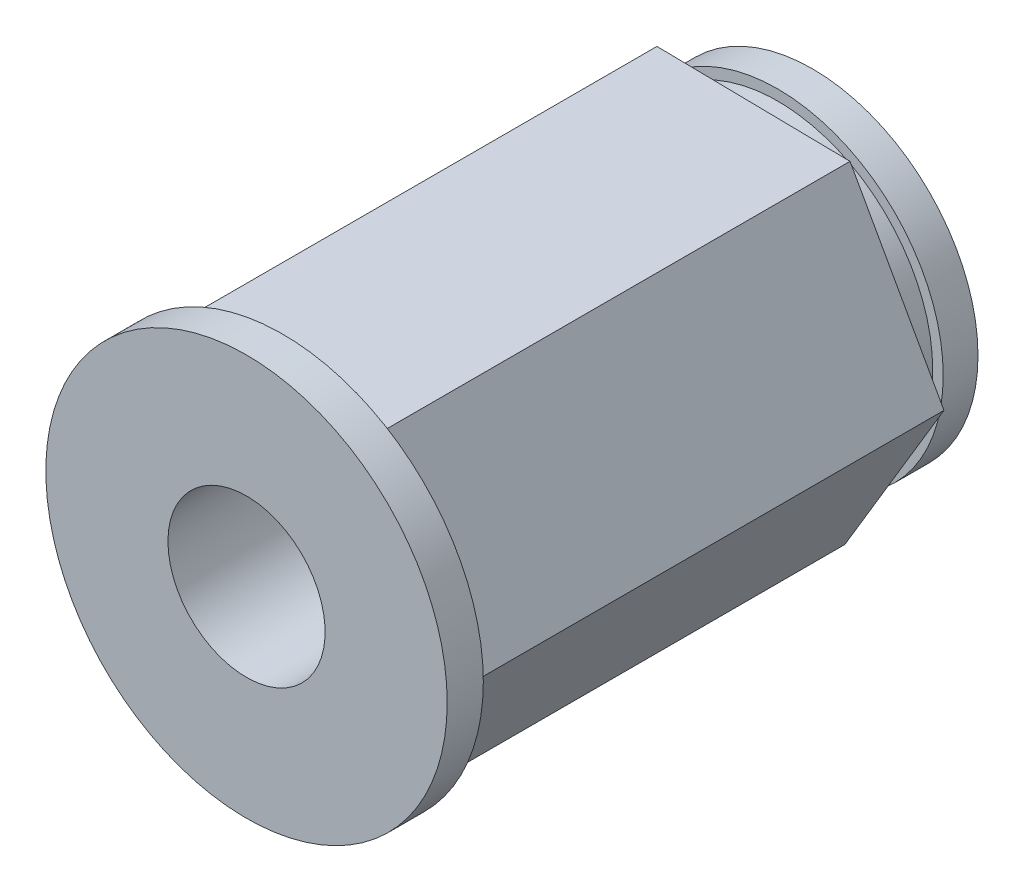
ISO-10303-21;
HEADER;
FILE_DESCRIPTION(('STEP AP214'),'2;1');
FILE_NAME('part.step','',(''),(''),'','','');
FILE_SCHEMA(('AUTOMOTIVE_DESIGN { 1 0 10303 214 1 1 1 1 }'));
ENDSEC;
DATA;
#1=APPLICATION_CONTEXT('core data for automotive mechanical design processes');
#2=APPLICATION_PROTOCOL_DEFINITION('international standard','automotive_design',2000,#1);
#3=PRODUCT_CONTEXT('',#1,'mechanical');
#4=PRODUCT('Part','Part','',(#3));
#5=PRODUCT_RELATED_PRODUCT_CATEGORY('part','',(#4));
#6=PRODUCT_DEFINITION_FORMATION('','',#4);
#7=PRODUCT_DEFINITION_CONTEXT('part definition',#1,'design');
#8=PRODUCT_DEFINITION('design','',#6,#7);
#9=PRODUCT_DEFINITION_SHAPE('','',#8);
#10=(LENGTH_UNIT() NAMED_UNIT(*) SI_UNIT(.MILLI.,.METRE.));
#11=(NAMED_UNIT(*) PLANE_ANGLE_UNIT() SI_UNIT($,.RADIAN.));
#12=(NAMED_UNIT(*) SI_UNIT($,.STERADIAN.) SOLID_ANGLE_UNIT());
#13=UNCERTAINTY_MEASURE_WITH_UNIT(LENGTH_MEASURE(1.E-05),#10,'distance_accuracy_value','');
#14=(GEOMETRIC_REPRESENTATION_CONTEXT(3) GLOBAL_UNCERTAINTY_ASSIGNED_CONTEXT((#13)) GLOBAL_UNIT_ASSIGNED_CONTEXT((#10,
#11,#12)) REPRESENTATION_CONTEXT('',''));
#15=CARTESIAN_POINT('',(0.,0.,0.));
#16=DIRECTION('',(0.,0.,1.));
#17=DIRECTION('',(1.,0.,0.));
#18=AXIS2_PLACEMENT_3D('',#15,#16,#17);
#19=CARTESIAN_POINT('',(0.,0.,-8.89));
#20=DIRECTION('',(0.,0.,1.));
#21=DIRECTION('',(1.,0.,0.));
#22=AXIS2_PLACEMENT_3D('',#19,#20,#21);
#23=PLANE('',#22);
#24=DIRECTION('',(-0.486564950383206,0.873644406528531,0.));
#25=VECTOR('',#24,1.);
#26=CARTESIAN_POINT('',(7.33147385372676,-0.113245156428048,-8.89));
#27=LINE('',#26,#25);
#28=CARTESIAN_POINT('',(7.33147385372676,-0.113245156428048,-8.89));
#29=VERTEX_POINT('',#28);
#30=CARTESIAN_POINT('',(3.76381010918559,6.29262002629474,-8.89));
#31=VERTEX_POINT('',#30);
#32=EDGE_CURVE('E123',#29,#31,#27,.T.);
#33=ORIENTED_EDGE('',*,*,#32,.F.);
#34=DIRECTION('',(0.513315774736285,0.858199810887236,0.));
#35=VECTOR('',#34,1.);
#36=CARTESIAN_POINT('',(3.56766374454116,-6.40586518272278,-8.89));
#37=LINE('',#36,#35);
#38=CARTESIAN_POINT('',(3.56766374454116,-6.40586518272278,-8.89));
#39=VERTEX_POINT('',#38);
#40=EDGE_CURVE('E133',#39,#29,#37,.T.);
#41=ORIENTED_EDGE('',*,*,#40,.F.);
#42=DIRECTION('',(0.99988072511949,-0.0154445956412951,0.));
#43=VECTOR('',#42,1.);
#44=CARTESIAN_POINT('',(-3.76381010918559,-6.29262002629474,-8.89));
#45=LINE('',#44,#43);
#46=CARTESIAN_POINT('',(-3.76381010918559,-6.29262002629474,-8.89));
#47=VERTEX_POINT('',#46);
#48=EDGE_CURVE('E131',#47,#39,#45,.T.);
#49=ORIENTED_EDGE('',*,*,#48,.F.);
#50=DIRECTION('',(0.486564950383205,-0.873644406528531,0.));
#51=VECTOR('',#50,1.);
#52=CARTESIAN_POINT('',(-7.33147385372675,0.113245156428045,-8.89));
#53=LINE('',#52,#51);
#54=CARTESIAN_POINT('',(-7.33147385372675,0.113245156428045,-8.89));
#55=VERTEX_POINT('',#54);
#56=EDGE_CURVE('E128',#55,#47,#53,.T.);
#57=ORIENTED_EDGE('',*,*,#56,.F.);
#58=DIRECTION('',(-0.513315774736285,-0.858199810887236,0.));
#59=VECTOR('',#58,1.);
#60=CARTESIAN_POINT('',(-3.56766374454115,6.40586518272278,-8.89));
#61=LINE('',#60,#59);
#62=CARTESIAN_POINT('',(-3.56766374454115,6.40586518272278,-8.89));
#63=VERTEX_POINT('',#62);
#64=EDGE_CURVE('E126',#63,#55,#61,.T.);
#65=ORIENTED_EDGE('',*,*,#64,.F.);
#66=DIRECTION('',(-0.99988072511949,0.0154445956412951,0.));
#67=VECTOR('',#66,1.);
#68=CARTESIAN_POINT('',(3.76381010918559,6.29262002629474,-8.89));
#69=LINE('',#68,#67);
#70=EDGE_CURVE('E105',#31,#63,#69,.T.);
#71=ORIENTED_EDGE('',*,*,#70,.F.);
#72=EDGE_LOOP('',(#33,#41,#49,#57,#65,#71));
#73=FACE_BOUND('',#72,.T.);
#74=CARTESIAN_POINT('',(0.,0.,-8.89));
#75=DIRECTION('',(0.,0.,1.));
#76=DIRECTION('',(1.,0.,0.));
#77=AXIS2_PLACEMENT_3D('',#74,#75,#76);
#78=CIRCLE('',#77,5.88645);
#79=CARTESIAN_POINT('',(5.88645,0.,-8.89));
#80=VERTEX_POINT('',#79);
#81=EDGE_CURVE('E11',#80,#80,#78,.F.);
#82=ORIENTED_EDGE('',*,*,#81,.F.);
#83=EDGE_LOOP('',(#82));
#84=FACE_BOUND('',#83,.T.);
#85=ADVANCED_FACE('F32',(#73,#84),#23,.F.);
#86=CARTESIAN_POINT('',(7.33147385372676,-0.113245156428048,-8.89));
#87=DIRECTION('',(0.87364440652853,0.486564950383206,0.));
#88=DIRECTION('',(-0.486564950383206,0.873644406528531,0.));
#89=AXIS2_PLACEMENT_3D('',#86,#87,#88);
#90=PLANE('',#89);
#91=DIRECTION('',(0.,0.,1.));
#92=VECTOR('',#91,1.);
#93=CARTESIAN_POINT('',(3.76381010918559,6.29262002629474,-8.89));
#94=LINE('',#93,#92);
#95=CARTESIAN_POINT('',(3.76381010918559,6.29262002629474,8.89));
#96=VERTEX_POINT('',#95);
#97=EDGE_CURVE('E106',#31,#96,#94,.T.);
#98=ORIENTED_EDGE('',*,*,#97,.T.);
#99=DIRECTION('',(-0.486564950383206,0.873644406528531,0.));
#100=VECTOR('',#99,1.);
#101=CARTESIAN_POINT('',(7.33147385372676,-0.113245156428048,8.89));
#102=LINE('',#101,#100);
#103=CARTESIAN_POINT('',(7.33147385372676,-0.113245156428048,8.89));
#104=VERTEX_POINT('',#103);
#105=EDGE_CURVE('E111',#104,#96,#102,.T.);
#106=ORIENTED_EDGE('',*,*,#105,.F.);
#107=DIRECTION('',(0.,0.,1.));
#108=VECTOR('',#107,1.);
#109=CARTESIAN_POINT('',(7.33147385372676,-0.113245156428048,-8.89));
#110=LINE('',#109,#108);
#111=EDGE_CURVE('E40',#29,#104,#110,.T.);
#112=ORIENTED_EDGE('',*,*,#111,.F.);
#113=ORIENTED_EDGE('',*,*,#32,.T.);
#114=EDGE_LOOP('',(#98,#106,#112,#113));
#115=FACE_BOUND('',#114,.T.);
#116=ADVANCED_FACE('F34',(#115),#90,.T.);
#117=CARTESIAN_POINT('',(3.56766374454116,-6.40586518272278,-8.89));
#118=DIRECTION('',(0.858199810887236,-0.513315774736285,0.));
#119=DIRECTION('',(0.513315774736285,0.858199810887236,0.));
#120=AXIS2_PLACEMENT_3D('',#117,#118,#119);
#121=PLANE('',#120);
#122=ORIENTED_EDGE('',*,*,#111,.T.);
#123=DIRECTION('',(0.513315774736285,0.858199810887236,0.));
#124=VECTOR('',#123,1.);
#125=CARTESIAN_POINT('',(3.56766374454116,-6.40586518272278,8.89));
#126=LINE('',#125,#124);
#127=CARTESIAN_POINT('',(3.56766374454116,-6.40586518272278,8.89));
#128=VERTEX_POINT('',#127);
#129=EDGE_CURVE('E121',#128,#104,#126,.T.);
#130=ORIENTED_EDGE('',*,*,#129,.F.);
#131=DIRECTION('',(0.,0.,1.));
#132=VECTOR('',#131,1.);
#133=CARTESIAN_POINT('',(3.56766374454116,-6.40586518272278,-8.89));
#134=LINE('',#133,#132);
#135=EDGE_CURVE('E54',#39,#128,#134,.T.);
#136=ORIENTED_EDGE('',*,*,#135,.F.);
#137=ORIENTED_EDGE('',*,*,#40,.T.);
#138=EDGE_LOOP('',(#122,#130,#136,#137));
#139=FACE_BOUND('',#138,.T.);
#140=ADVANCED_FACE('F149',(#139),#121,.T.);
#141=CARTESIAN_POINT('',(-3.76381010918559,-6.29262002629474,-8.89));
#142=DIRECTION('',(-0.0154445956412951,-0.99988072511949,0.));
#143=DIRECTION('',(0.99988072511949,-0.0154445956412951,0.));
#144=AXIS2_PLACEMENT_3D('',#141,#142,#143);
#145=PLANE('',#144);
#146=ORIENTED_EDGE('',*,*,#135,.T.);
#147=DIRECTION('',(0.99988072511949,-0.0154445956412951,0.));
#148=VECTOR('',#147,1.);
#149=CARTESIAN_POINT('',(-3.76381010918559,-6.29262002629474,8.89));
#150=LINE('',#149,#148);
#151=CARTESIAN_POINT('',(-3.76381010918559,-6.29262002629474,8.89));
#152=VERTEX_POINT('',#151);
#153=EDGE_CURVE('E118',#152,#128,#150,.T.);
#154=ORIENTED_EDGE('',*,*,#153,.F.);
#155=DIRECTION('',(0.,0.,1.));
#156=VECTOR('',#155,1.);
#157=CARTESIAN_POINT('',(-3.76381010918559,-6.29262002629474,-8.89));
#158=LINE('',#157,#156);
#159=EDGE_CURVE('E137',#47,#152,#158,.T.);
#160=ORIENTED_EDGE('',*,*,#159,.F.);
#161=ORIENTED_EDGE('',*,*,#48,.T.);
#162=EDGE_LOOP('',(#146,#154,#160,#161));
#163=FACE_BOUND('',#162,.T.);
#164=ADVANCED_FACE('F148',(#163),#145,.T.);
#165=CARTESIAN_POINT('',(-7.33147385372675,0.113245156428045,-8.89));
#166=DIRECTION('',(-0.873644406528531,-0.486564950383205,0.));
#167=DIRECTION('',(0.486564950383205,-0.873644406528531,0.));
#168=AXIS2_PLACEMENT_3D('',#165,#166,#167);
#169=PLANE('',#168);
#170=ORIENTED_EDGE('',*,*,#159,.T.);
#171=DIRECTION('',(0.486564950383205,-0.873644406528531,0.));
#172=VECTOR('',#171,1.);
#173=CARTESIAN_POINT('',(-7.33147385372675,0.113245156428045,8.89));
#174=LINE('',#173,#172);
#175=CARTESIAN_POINT('',(-7.33147385372675,0.113245156428045,8.89));
#176=VERTEX_POINT('',#175);
#177=EDGE_CURVE('E96',#176,#152,#174,.T.);
#178=ORIENTED_EDGE('',*,*,#177,.F.);
#179=DIRECTION('',(0.,0.,1.));
#180=VECTOR('',#179,1.);
#181=CARTESIAN_POINT('',(-7.33147385372675,0.113245156428045,-8.89));
#182=LINE('',#181,#180);
#183=EDGE_CURVE('E91',#55,#176,#182,.T.);
#184=ORIENTED_EDGE('',*,*,#183,.F.);
#185=ORIENTED_EDGE('',*,*,#56,.T.);
#186=EDGE_LOOP('',(#170,#178,#184,#185));
#187=FACE_BOUND('',#186,.T.);
#188=ADVANCED_FACE('F145',(#187),#169,.T.);
#189=CARTESIAN_POINT('',(-3.56766374454115,6.40586518272278,-8.89));
#190=DIRECTION('',(-0.858199810887236,0.513315774736285,0.));
#191=DIRECTION('',(-0.513315774736285,-0.858199810887236,0.));
#192=AXIS2_PLACEMENT_3D('',#189,#190,#191);
#193=PLANE('',#192);
#194=ORIENTED_EDGE('',*,*,#183,.T.);
#195=DIRECTION('',(-0.513315774736285,-0.858199810887236,0.));
#196=VECTOR('',#195,1.);
#197=CARTESIAN_POINT('',(-3.56766374454115,6.40586518272278,8.89));
#198=LINE('',#197,#196);
#199=CARTESIAN_POINT('',(-3.56766374454115,6.40586518272278,8.89));
#200=VERTEX_POINT('',#199);
#201=EDGE_CURVE('E85',#200,#176,#198,.T.);
#202=ORIENTED_EDGE('',*,*,#201,.F.);
#203=DIRECTION('',(0.,0.,1.));
#204=VECTOR('',#203,1.);
#205=CARTESIAN_POINT('',(-3.56766374454115,6.40586518272278,-8.89));
#206=LINE('',#205,#204);
#207=EDGE_CURVE('E89',#63,#200,#206,.T.);
#208=ORIENTED_EDGE('',*,*,#207,.F.);
#209=ORIENTED_EDGE('',*,*,#64,.T.);
#210=EDGE_LOOP('',(#194,#202,#208,#209));
#211=FACE_BOUND('',#210,.T.);
#212=ADVANCED_FACE('F87',(#211),#193,.T.);
#213=CARTESIAN_POINT('',(3.76381010918559,6.29262002629474,-8.89));
#214=DIRECTION('',(0.0154445956412951,0.99988072511949,0.));
#215=DIRECTION('',(-0.99988072511949,0.0154445956412951,0.));
#216=AXIS2_PLACEMENT_3D('',#213,#214,#215);
#217=PLANE('',#216);
#218=ORIENTED_EDGE('',*,*,#207,.T.);
#219=DIRECTION('',(-0.99988072511949,0.0154445956412951,0.));
#220=VECTOR('',#219,1.);
#221=CARTESIAN_POINT('',(3.76381010918559,6.29262002629474,8.89));
#222=LINE('',#221,#220);
#223=EDGE_CURVE('E97',#96,#200,#222,.T.);
#224=ORIENTED_EDGE('',*,*,#223,.F.);
#225=ORIENTED_EDGE('',*,*,#97,.F.);
#226=ORIENTED_EDGE('',*,*,#70,.T.);
#227=EDGE_LOOP('',(#218,#224,#225,#226));
#228=FACE_BOUND('',#227,.T.);
#229=ADVANCED_FACE('F102',(#228),#217,.T.);
#230=CARTESIAN_POINT('',(0.,0.,10.2616));
#231=DIRECTION('',(0.,0.,-1.));
#232=DIRECTION('',(-1.,0.,0.));
#233=AXIS2_PLACEMENT_3D('',#230,#231,#232);
#234=CYLINDRICAL_SURFACE('',#233,7.62);
#235=CARTESIAN_POINT('',(0.,0.,10.2616));
#236=DIRECTION('',(0.,0.,1.));
#237=DIRECTION('',(1.,0.,0.));
#238=AXIS2_PLACEMENT_3D('',#235,#236,#237);
#239=CIRCLE('',#238,7.62);
#240=CARTESIAN_POINT('',(7.62,0.,10.2616));
#241=VERTEX_POINT('',#240);
#242=EDGE_CURVE('E113',#241,#241,#239,.T.);
#243=ORIENTED_EDGE('',*,*,#242,.F.);
#244=EDGE_LOOP('',(#243));
#245=FACE_BOUND('',#244,.T.);
#246=CARTESIAN_POINT('',(0.,0.,8.89));
#247=DIRECTION('',(0.,0.,1.));
#248=DIRECTION('',(1.,0.,0.));
#249=AXIS2_PLACEMENT_3D('',#246,#247,#248);
#250=CIRCLE('',#249,7.62);
#251=CARTESIAN_POINT('',(7.62,0.,8.89));
#252=VERTEX_POINT('',#251);
#253=EDGE_CURVE('E212',#252,#252,#250,.T.);
#254=ORIENTED_EDGE('',*,*,#253,.T.);
#255=EDGE_LOOP('',(#254));
#256=FACE_BOUND('',#255,.T.);
#257=ADVANCED_FACE('F162',(#245,#256),#234,.T.);
#258=CARTESIAN_POINT('',(0.,0.,10.2616));
#259=DIRECTION('',(0.,0.,1.));
#260=DIRECTION('',(1.,0.,0.));
#261=AXIS2_PLACEMENT_3D('',#258,#259,#260);
#262=PLANE('',#261);
#263=CARTESIAN_POINT('',(0.,0.,10.2616));
#264=DIRECTION('',(0.,0.,-1.));
#265=DIRECTION('',(-1.,0.,0.));
#266=AXIS2_PLACEMENT_3D('',#263,#264,#265);
#267=CIRCLE('',#266,2.9845);
#268=CARTESIAN_POINT('',(-2.9845,0.,10.2616));
#269=VERTEX_POINT('',#268);
#270=EDGE_CURVE('E196',#269,#269,#267,.T.);
#271=ORIENTED_EDGE('',*,*,#270,.T.);
#272=EDGE_LOOP('',(#271));
#273=FACE_BOUND('',#272,.T.);
#274=ORIENTED_EDGE('',*,*,#242,.T.);
#275=EDGE_LOOP('',(#274));
#276=FACE_BOUND('',#275,.T.);
#277=ADVANCED_FACE('F165',(#273,#276),#262,.T.);
#278=CARTESIAN_POINT('',(0.,0.,8.89));
#279=DIRECTION('',(0.,0.,1.));
#280=DIRECTION('',(1.,0.,0.));
#281=AXIS2_PLACEMENT_3D('',#278,#279,#280);
#282=PLANE('',#281);
#283=ORIENTED_EDGE('',*,*,#105,.T.);
#284=ORIENTED_EDGE('',*,*,#223,.T.);
#285=ORIENTED_EDGE('',*,*,#201,.T.);
#286=ORIENTED_EDGE('',*,*,#177,.T.);
#287=ORIENTED_EDGE('',*,*,#153,.T.);
#288=ORIENTED_EDGE('',*,*,#129,.T.);
#289=EDGE_LOOP('',(#283,#284,#285,#286,#287,#288));
#290=FACE_BOUND('',#289,.T.);
#291=ORIENTED_EDGE('',*,*,#253,.F.);
#292=EDGE_LOOP('',(#291));
#293=FACE_BOUND('',#292,.T.);
#294=ADVANCED_FACE('F108',(#290,#293),#282,.F.);
#295=CARTESIAN_POINT('',(0.,0.,-9.906));
#296=DIRECTION('',(0.,0.,1.));
#297=DIRECTION('',(1.,0.,0.));
#298=AXIS2_PLACEMENT_3D('',#295,#296,#297);
#299=CYLINDRICAL_SURFACE('',#298,5.88645);
#300=CARTESIAN_POINT('',(0.,0.,-9.906));
#301=DIRECTION('',(0.,0.,-1.));
#302=DIRECTION('',(-1.,0.,0.));
#303=AXIS2_PLACEMENT_3D('',#300,#301,#302);
#304=CIRCLE('',#303,5.88645);
#305=CARTESIAN_POINT('',(-5.88645,0.,-9.906));
#306=VERTEX_POINT('',#305);
#307=EDGE_CURVE('E207',#306,#306,#304,.T.);
#308=ORIENTED_EDGE('',*,*,#307,.F.);
#309=EDGE_LOOP('',(#308));
#310=FACE_BOUND('',#309,.T.);
#311=ORIENTED_EDGE('',*,*,#81,.T.);
#312=EDGE_LOOP('',(#311));
#313=FACE_BOUND('',#312,.T.);
#314=ADVANCED_FACE('F169',(#310,#313),#299,.T.);
#315=CARTESIAN_POINT('',(0.,0.,-9.906));
#316=DIRECTION('',(0.,0.,-1.));
#317=DIRECTION('',(-1.,0.,0.));
#318=AXIS2_PLACEMENT_3D('',#315,#316,#317);
#319=PLANE('',#318);
#320=CARTESIAN_POINT('',(0.,0.,-9.906));
#321=DIRECTION('',(0.,0.,-1.));
#322=DIRECTION('',(-1.,0.,0.));
#323=AXIS2_PLACEMENT_3D('',#320,#321,#322);
#324=CIRCLE('',#323,6.2865);
#325=CARTESIAN_POINT('',(-6.2865,0.,-9.906));
#326=VERTEX_POINT('',#325);
#327=EDGE_CURVE('E201',#326,#326,#324,.T.);
#328=ORIENTED_EDGE('',*,*,#327,.F.);
#329=EDGE_LOOP('',(#328));
#330=FACE_BOUND('',#329,.T.);
#331=ORIENTED_EDGE('',*,*,#307,.T.);
#332=EDGE_LOOP('',(#331));
#333=FACE_BOUND('',#332,.T.);
#334=ADVANCED_FACE('F175',(#330,#333),#319,.F.);
#335=CARTESIAN_POINT('',(0.,0.,-11.2268));
#336=DIRECTION('',(0.,0.,1.));
#337=DIRECTION('',(1.,0.,0.));
#338=AXIS2_PLACEMENT_3D('',#335,#336,#337);
#339=CYLINDRICAL_SURFACE('',#338,6.2865);
#340=CARTESIAN_POINT('',(0.,0.,-11.2268));
#341=DIRECTION('',(0.,0.,-1.));
#342=DIRECTION('',(-1.,0.,0.));
#343=AXIS2_PLACEMENT_3D('',#340,#341,#342);
#344=CIRCLE('',#343,6.2865);
#345=CARTESIAN_POINT('',(-6.2865,0.,-11.2268));
#346=VERTEX_POINT('',#345);
#347=EDGE_CURVE('E204',#346,#346,#344,.T.);
#348=ORIENTED_EDGE('',*,*,#347,.F.);
#349=EDGE_LOOP('',(#348));
#350=FACE_BOUND('',#349,.T.);
#351=ORIENTED_EDGE('',*,*,#327,.T.);
#352=EDGE_LOOP('',(#351));
#353=FACE_BOUND('',#352,.T.);
#354=ADVANCED_FACE('F177',(#350,#353),#339,.T.);
#355=CARTESIAN_POINT('',(0.,0.,-11.2268));
#356=DIRECTION('',(0.,0.,-1.));
#357=DIRECTION('',(-1.,0.,0.));
#358=AXIS2_PLACEMENT_3D('',#355,#356,#357);
#359=PLANE('',#358);
#360=CARTESIAN_POINT('',(0.,0.,-11.2268));
#361=DIRECTION('',(0.,0.,-1.));
#362=DIRECTION('',(-1.,0.,0.));
#363=AXIS2_PLACEMENT_3D('',#360,#361,#362);
#364=CIRCLE('',#363,2.9845);
#365=CARTESIAN_POINT('',(-2.9845,0.,-11.2268));
#366=VERTEX_POINT('',#365);
#367=EDGE_CURVE('E199',#366,#366,#364,.T.);
#368=ORIENTED_EDGE('',*,*,#367,.F.);
#369=EDGE_LOOP('',(#368));
#370=FACE_BOUND('',#369,.T.);
#371=ORIENTED_EDGE('',*,*,#347,.T.);
#372=EDGE_LOOP('',(#371));
#373=FACE_BOUND('',#372,.T.);
#374=ADVANCED_FACE('F180',(#370,#373),#359,.T.);
#375=CARTESIAN_POINT('',(0.,0.,10.2616));
#376=DIRECTION('',(0.,0.,-1.));
#377=DIRECTION('',(-1.,0.,0.));
#378=AXIS2_PLACEMENT_3D('',#375,#376,#377);
#379=CYLINDRICAL_SURFACE('',#378,2.9845);
#380=ORIENTED_EDGE('',*,*,#270,.F.);
#381=EDGE_LOOP('',(#380));
#382=FACE_BOUND('',#381,.T.);
#383=ORIENTED_EDGE('',*,*,#367,.T.);
#384=EDGE_LOOP('',(#383));
#385=FACE_BOUND('',#384,.T.);
#386=ADVANCED_FACE('F187',(#382,#385),#379,.F.);
#387=CLOSED_SHELL('',(#85,#116,#140,#164,#188,#212,#229,#257,#277,#294,#314,#334,#354,#374,#386));
#388=MANIFOLD_SOLID_BREP('B2',#387);
#389=ADVANCED_BREP_SHAPE_REPRESENTATION('',(#18,#388),#14);
#390=SHAPE_DEFINITION_REPRESENTATION(#9,#389);
ENDSEC;
END-ISO-10303-21;
